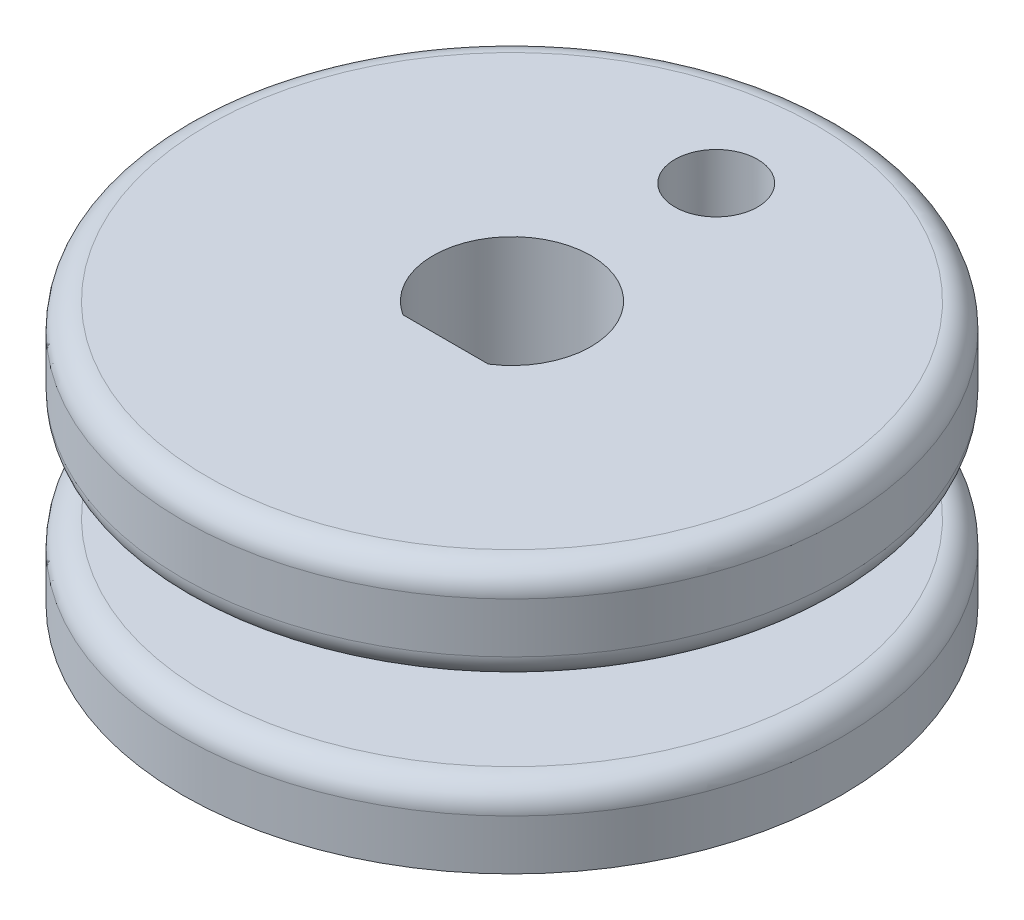
ISO-10303-21;
HEADER;
FILE_DESCRIPTION(('STEP AP214'),'2;1');
FILE_NAME('part.step','',(''),(''),'','','');
FILE_SCHEMA(('AUTOMOTIVE_DESIGN { 1 0 10303 214 1 1 1 1 }'));
ENDSEC;
DATA;
#1=APPLICATION_CONTEXT('core data for automotive mechanical design processes');
#2=APPLICATION_PROTOCOL_DEFINITION('international standard','automotive_design',2000,#1);
#3=PRODUCT_CONTEXT('',#1,'mechanical');
#4=PRODUCT('Part','Part','',(#3));
#5=PRODUCT_RELATED_PRODUCT_CATEGORY('part','',(#4));
#6=PRODUCT_DEFINITION_FORMATION('','',#4);
#7=PRODUCT_DEFINITION_CONTEXT('part definition',#1,'design');
#8=PRODUCT_DEFINITION('design','',#6,#7);
#9=PRODUCT_DEFINITION_SHAPE('','',#8);
#10=(LENGTH_UNIT() NAMED_UNIT(*) SI_UNIT(.MILLI.,.METRE.));
#11=(NAMED_UNIT(*) PLANE_ANGLE_UNIT() SI_UNIT($,.RADIAN.));
#12=(NAMED_UNIT(*) SI_UNIT($,.STERADIAN.) SOLID_ANGLE_UNIT());
#13=UNCERTAINTY_MEASURE_WITH_UNIT(LENGTH_MEASURE(1.E-05),#10,'distance_accuracy_value','');
#14=(GEOMETRIC_REPRESENTATION_CONTEXT(3) GLOBAL_UNCERTAINTY_ASSIGNED_CONTEXT((#13)) GLOBAL_UNIT_ASSIGNED_CONTEXT((#10,
#11,#12)) REPRESENTATION_CONTEXT('',''));
#15=CARTESIAN_POINT('',(0.,0.,0.));
#16=DIRECTION('',(0.,0.,1.));
#17=DIRECTION('',(1.,0.,0.));
#18=AXIS2_PLACEMENT_3D('',#15,#16,#17);
#19=CARTESIAN_POINT('',(13.15,0.,0.));
#20=DIRECTION('',(0.,1.,0.));
#21=DIRECTION('',(0.,0.,1.));
#22=AXIS2_PLACEMENT_3D('',#19,#20,#21);
#23=PLANE('',#22);
#24=CARTESIAN_POINT('',(0.,0.,0.));
#25=DIRECTION('',(0.,1.,0.));
#26=DIRECTION('',(0.,0.,1.));
#27=AXIS2_PLACEMENT_3D('',#24,#25,#26);
#28=CIRCLE('',#27,13.15);
#29=CARTESIAN_POINT('',(0.,0.,13.15));
#30=VERTEX_POINT('',#29);
#31=EDGE_CURVE('E210',#30,#30,#28,.T.);
#32=ORIENTED_EDGE('',*,*,#31,.F.);
#33=EDGE_LOOP('',(#32));
#34=FACE_BOUND('',#33,.T.);
#35=CARTESIAN_POINT('',(0.,0.,0.));
#36=DIRECTION('',(0.,1.,0.));
#37=DIRECTION('',(0.,0.,1.));
#38=AXIS2_PLACEMENT_3D('',#35,#36,#37);
#39=CIRCLE('',#38,6.);
#40=CARTESIAN_POINT('',(0.,0.,6.));
#41=VERTEX_POINT('',#40);
#42=EDGE_CURVE('E11',#41,#41,#39,.F.);
#43=ORIENTED_EDGE('',*,*,#42,.F.);
#44=EDGE_LOOP('',(#43));
#45=FACE_BOUND('',#44,.T.);
#46=ADVANCED_FACE('F41',(#34,#45),#23,.F.);
#47=CARTESIAN_POINT('',(0.,0.,0.));
#48=DIRECTION('',(0.,1.,0.));
#49=DIRECTION('',(0.,0.,1.));
#50=AXIS2_PLACEMENT_3D('',#47,#48,#49);
#51=CYLINDRICAL_SURFACE('',#50,3.15);
#52=CARTESIAN_POINT('',(0.,10.5,0.));
#53=DIRECTION('',(0.,1.,0.));
#54=DIRECTION('',(0.,0.,1.));
#55=AXIS2_PLACEMENT_3D('',#52,#53,#54);
#56=CIRCLE('',#55,3.15);
#57=CARTESIAN_POINT('',(-1.70293863659264,10.5,2.65));
#58=VERTEX_POINT('',#57);
#59=CARTESIAN_POINT('',(1.70293863659264,10.5,2.65));
#60=VERTEX_POINT('',#59);
#61=EDGE_CURVE('E49',#58,#60,#56,.F.);
#62=ORIENTED_EDGE('',*,*,#61,.F.);
#63=DIRECTION('',(0.,-1.,0.));
#64=VECTOR('',#63,1.);
#65=CARTESIAN_POINT('',(-1.70293863659264,20.4423828956117,2.65));
#66=LINE('',#65,#64);
#67=CARTESIAN_POINT('',(-1.70293863659264,-2.,2.65));
#68=VERTEX_POINT('',#67);
#69=EDGE_CURVE('E90',#58,#68,#66,.T.);
#70=ORIENTED_EDGE('',*,*,#69,.T.);
#71=CARTESIAN_POINT('',(0.,-2.,0.));
#72=DIRECTION('',(0.,-1.,0.));
#73=DIRECTION('',(0.,0.,-1.));
#74=AXIS2_PLACEMENT_3D('',#71,#72,#73);
#75=CIRCLE('',#74,3.15);
#76=CARTESIAN_POINT('',(1.70293863659264,-2.,2.65));
#77=VERTEX_POINT('',#76);
#78=EDGE_CURVE('E93',#68,#77,#75,.T.);
#79=ORIENTED_EDGE('',*,*,#78,.T.);
#80=DIRECTION('',(0.,-1.,0.));
#81=VECTOR('',#80,1.);
#82=CARTESIAN_POINT('',(1.70293863659264,20.4423828956117,2.65));
#83=LINE('',#82,#81);
#84=EDGE_CURVE('E81',#60,#77,#83,.T.);
#85=ORIENTED_EDGE('',*,*,#84,.F.);
#86=EDGE_LOOP('',(#62,#70,#79,#85));
#87=FACE_BOUND('',#86,.T.);
#88=ADVANCED_FACE('F88',(#87),#51,.F.);
#89=CARTESIAN_POINT('',(1.70293863659264,20.4423828956117,2.65));
#90=DIRECTION('',(0.,0.,-1.));
#91=DIRECTION('',(-1.,0.,0.));
#92=AXIS2_PLACEMENT_3D('',#89,#90,#91);
#93=PLANE('',#92);
#94=ORIENTED_EDGE('',*,*,#69,.F.);
#95=DIRECTION('',(1.,0.,0.));
#96=VECTOR('',#95,1.);
#97=CARTESIAN_POINT('',(1.70293863659264,10.5,2.65));
#98=LINE('',#97,#96);
#99=EDGE_CURVE('E57',#58,#60,#98,.T.);
#100=ORIENTED_EDGE('',*,*,#99,.T.);
#101=ORIENTED_EDGE('',*,*,#84,.T.);
#102=DIRECTION('',(-1.,0.,0.));
#103=VECTOR('',#102,1.);
#104=CARTESIAN_POINT('',(-1.70293863659264,-2.,2.65));
#105=LINE('',#104,#103);
#106=EDGE_CURVE('E92',#77,#68,#105,.T.);
#107=ORIENTED_EDGE('',*,*,#106,.T.);
#108=EDGE_LOOP('',(#94,#100,#101,#107));
#109=FACE_BOUND('',#108,.T.);
#110=ADVANCED_FACE('F98',(#109),#93,.T.);
#111=CARTESIAN_POINT('',(0.,0.,0.));
#112=DIRECTION('',(0.,1.,0.));
#113=DIRECTION('',(0.,0.,1.));
#114=AXIS2_PLACEMENT_3D('',#111,#112,#113);
#115=CYLINDRICAL_SURFACE('',#114,13.15);
#116=CARTESIAN_POINT('',(0.,2.,0.));
#117=DIRECTION('',(0.,-1.,0.));
#118=DIRECTION('',(0.,0.,-1.));
#119=AXIS2_PLACEMENT_3D('',#116,#117,#118);
#120=CIRCLE('',#119,13.15);
#121=CARTESIAN_POINT('',(0.,2.,-13.15));
#122=VERTEX_POINT('',#121);
#123=EDGE_CURVE('E217',#122,#122,#120,.T.);
#124=ORIENTED_EDGE('',*,*,#123,.T.);
#125=EDGE_LOOP('',(#124));
#126=FACE_BOUND('',#125,.T.);
#127=ORIENTED_EDGE('',*,*,#31,.T.);
#128=EDGE_LOOP('',(#127));
#129=FACE_BOUND('',#128,.T.);
#130=ADVANCED_FACE('F160',(#126,#129),#115,.T.);
#131=CARTESIAN_POINT('',(6.15,3.,0.));
#132=DIRECTION('',(0.,-1.,0.));
#133=DIRECTION('',(0.,0.,-1.));
#134=AXIS2_PLACEMENT_3D('',#131,#132,#133);
#135=PLANE('',#134);
#136=CARTESIAN_POINT('',(0.,3.,0.));
#137=DIRECTION('',(0.,-1.,0.));
#138=DIRECTION('',(0.,0.,-1.));
#139=AXIS2_PLACEMENT_3D('',#136,#137,#138);
#140=CIRCLE('',#139,7.15);
#141=CARTESIAN_POINT('',(0.,3.,-7.15));
#142=VERTEX_POINT('',#141);
#143=EDGE_CURVE('E198',#142,#142,#140,.T.);
#144=ORIENTED_EDGE('',*,*,#143,.T.);
#145=EDGE_LOOP('',(#144));
#146=FACE_BOUND('',#145,.T.);
#147=CARTESIAN_POINT('',(0.,3.,0.));
#148=DIRECTION('',(0.,-1.,0.));
#149=DIRECTION('',(0.,0.,-1.));
#150=AXIS2_PLACEMENT_3D('',#147,#148,#149);
#151=CIRCLE('',#150,12.15);
#152=CARTESIAN_POINT('',(0.,3.,-12.15));
#153=VERTEX_POINT('',#152);
#154=EDGE_CURVE('E205',#153,#153,#151,.F.);
#155=ORIENTED_EDGE('',*,*,#154,.T.);
#156=EDGE_LOOP('',(#155));
#157=FACE_BOUND('',#156,.T.);
#158=ADVANCED_FACE('F157',(#146,#157),#135,.F.);
#159=CARTESIAN_POINT('',(0.,0.,0.));
#160=DIRECTION('',(0.,1.,0.));
#161=DIRECTION('',(0.,0.,1.));
#162=AXIS2_PLACEMENT_3D('',#159,#160,#161);
#163=CYLINDRICAL_SURFACE('',#162,6.15);
#164=CARTESIAN_POINT('',(0.,4.,0.));
#165=DIRECTION('',(0.,-1.,0.));
#166=DIRECTION('',(0.,0.,-1.));
#167=AXIS2_PLACEMENT_3D('',#164,#165,#166);
#168=CIRCLE('',#167,6.15);
#169=CARTESIAN_POINT('',(0.,4.,-6.15));
#170=VERTEX_POINT('',#169);
#171=EDGE_CURVE('E183',#170,#170,#168,.F.);
#172=ORIENTED_EDGE('',*,*,#171,.T.);
#173=EDGE_LOOP('',(#172));
#174=FACE_BOUND('',#173,.T.);
#175=CARTESIAN_POINT('',(1.3127843484041,6.5,-7.15045147462206));
#176=CARTESIAN_POINT('',(1.04201943039474,6.62580417613551,-6.06761894385592));
#177=CARTESIAN_POINT('',(1.31709547902875,5.5384392511523,-6.00730883999833));
#178=CARTESIAN_POINT('',(1.29999795773943,6.5,-7.13378030248643));
#179=CARTESIAN_POINT('',(1.05352528249642,6.60720938370653,-6.06269279068864));
#180=CARTESIAN_POINT('',(1.26815420173258,5.52328600104773,-6.01805865413124));
#181=CARTESIAN_POINT('',(1.28535391653933,6.5,-7.11509785990725));
#182=CARTESIAN_POINT('',(1.06063421512086,6.58438398406775,-6.05974291762612));
#183=CARTESIAN_POINT('',(1.2181836288793,5.51291016419798,-6.02836916312205));
#184=CARTESIAN_POINT('',(1.25129735969783,6.5,-7.07412083590968));
#185=CARTESIAN_POINT('',(1.06264570010002,6.53484200602748,-6.05757336936055));
#186=CARTESIAN_POINT('',(1.11832476871229,5.50081077814163,-6.04767043834936));
#187=CARTESIAN_POINT('',(1.23199392769864,6.5,-7.05191238150087));
#188=CARTESIAN_POINT('',(1.05807280539704,6.50845185206623,-6.0581983266329));
#189=CARTESIAN_POINT('',(1.0684577316884,5.49890631686951,-6.05668477927272));
#190=CARTESIAN_POINT('',(1.19016344800248,6.5,-7.00684277997503));
#191=CARTESIAN_POINT('',(1.03683458778687,6.45855806361104,-6.06219366481164));
#192=CARTESIAN_POINT('',(0.975488457942046,5.50205963254275,-6.07230217026224));
#193=CARTESIAN_POINT('',(1.16842378399548,6.5,-6.98447480328383));
#194=CARTESIAN_POINT('',(1.02220347215222,6.43531445915879,-6.06511341829274));
#195=CARTESIAN_POINT('',(0.932382110146065,5.50621191766008,-6.07906645716621));
#196=CARTESIAN_POINT('',(1.11912346520524,6.5,-6.93705350439338));
#197=CARTESIAN_POINT('',(0.98277076333591,6.39063772801981,-6.07250505017338));
#198=CARTESIAN_POINT('',(0.846506896377061,5.51899256956758,-6.09161774292795));
#199=CARTESIAN_POINT('',(1.09155889521425,6.5,-6.91199838163673));
#200=CARTESIAN_POINT('',(0.958259250261157,6.36921118246873,-6.07693111209655));
#201=CARTESIAN_POINT('',(0.803738277567529,5.52762395269032,-6.0974040797251));
#202=CARTESIAN_POINT('',(1.02877554087987,6.5,-6.85932955119865));
#203=CARTESIAN_POINT('',(0.899148274282506,6.32949393555928,-6.08669110781247));
#204=CARTESIAN_POINT('',(0.717980252858712,5.54850824237402,-6.10810178400074));
#205=CARTESIAN_POINT('',(0.99343122157243,6.5,-6.83167873440837));
#206=CARTESIAN_POINT('',(0.864661540570795,6.31118916209162,-6.09201329363481));
#207=CARTESIAN_POINT('',(0.675000086390885,5.56082189605999,-6.11299606296244));
#208=CARTESIAN_POINT('',(0.913828808476283,6.5,-6.77530080949762));
#209=CARTESIAN_POINT('',(0.786729869202295,6.27913669131568,-6.10279361029693));
#210=CARTESIAN_POINT('',(0.589497709066172,5.58772018676518,-6.12183312770505));
#211=CARTESIAN_POINT('',(0.869572265583208,6.5,-6.74657388934651));
#212=CARTESIAN_POINT('',(0.743519372589439,6.26527232221814,-6.10824783675761));
#213=CARTESIAN_POINT('',(0.546975419884405,5.60230442855904,-6.12577607877297));
#214=CARTESIAN_POINT('',(0.773791980389226,6.5,-6.69171881956269));
#215=CARTESIAN_POINT('',(0.652161908003435,6.2429907440322,-6.11834962774675));
#216=CARTESIAN_POINT('',(0.464850057399202,5.63118983103073,-6.13253608134874));
#217=CARTESIAN_POINT('',(0.722940346879625,6.5,-6.66554425753131));
#218=CARTESIAN_POINT('',(0.604700506220856,6.23418109011878,-6.12303519120669));
#219=CARTESIAN_POINT('',(0.425239479694907,5.64544618466377,-6.1354102525107));
#220=CARTESIAN_POINT('',(0.610936935296231,6.5,-6.61605030436122));
#221=CARTESIAN_POINT('',(0.50350264960542,6.22022124889756,-6.13157885886108));
#222=CARTESIAN_POINT('',(0.345663521389621,5.67294509306369,-6.14040778803974));
#223=CARTESIAN_POINT('',(0.549776854377754,6.5,-6.59273324112492));
#224=CARTESIAN_POINT('',(0.449735812891642,6.21498096637913,-6.13546529374919));
#225=CARTESIAN_POINT('',(0.30569787958331,5.68618681800097,-6.14253054287838));
#226=CARTESIAN_POINT('',(0.418795378426861,6.5,-6.55260798451918));
#227=CARTESIAN_POINT('',(0.338214897762957,6.20740453632916,-6.14193702490164));
#228=CARTESIAN_POINT('',(0.226008039384106,5.70923625577028,-6.14597180329572));
#229=CARTESIAN_POINT('',(0.349224390472018,6.5,-6.53565363326016));
#230=CARTESIAN_POINT('',(0.280427685906946,6.20494276307205,-6.14458379473749));
#231=CARTESIAN_POINT('',(0.186302135462554,5.71912050990874,-6.1473088284107));
#232=CARTESIAN_POINT('',(0.202884671617475,6.5,-6.51085963783064));
#233=CARTESIAN_POINT('',(0.161594548139622,6.20172875753899,-6.14837644757747));
#234=CARTESIAN_POINT('',(0.106215643730336,5.73364374686564,-6.1492123622092));
#235=CARTESIAN_POINT('',(0.126136214194429,6.5,-6.50299511171356));
#236=CARTESIAN_POINT('',(0.100188110206605,6.2009455183902,-6.14955281336864));
#237=CARTESIAN_POINT('',(0.0658372061053902,5.7382970476223,-6.14978097502525));
#238=CARTESIAN_POINT('',(-0.0306001423340267,6.5,-6.49838778387458));
#239=CARTESIAN_POINT('',(-0.0242638770388407,6.200461642862,-6.15024043781845));
#240=CARTESIAN_POINT('',(-0.0160110200897598,5.74101749000896,-6.15011813244039));
#241=CARTESIAN_POINT('',(-0.110622097708201,6.5,-6.50189793433717));
#242=CARTESIAN_POINT('',(-0.0878460754356238,6.20078171284095,-6.1497196203914));
#243=CARTESIAN_POINT('',(-0.0574850021710199,5.73893483821878,-6.14986847887742));
#244=CARTESIAN_POINT('',(-0.265176079438557,6.5,-6.5195694584828));
#245=CARTESIAN_POINT('',(-0.211802048852702,6.20282639280922,-6.14705317811521));
#246=CARTESIAN_POINT('',(-0.139881690342273,5.72853667877155,-6.14854794084975));
#247=CARTESIAN_POINT('',(-0.339693706481335,6.5,-6.53375775292792));
#248=CARTESIAN_POINT('',(-0.272637782164196,6.20457191642582,-6.14488216661165));
#249=CARTESIAN_POINT('',(-0.180802736545599,5.72020541787397,-6.14747498060543));
#250=CARTESIAN_POINT('',(-0.48082212570908,6.5,-6.56987566848276));
#251=CARTESIAN_POINT('',(-0.390458057955785,6.21045971678479,-6.13918396472128));
#252=CARTESIAN_POINT('',(-0.262852025443541,5.69927865768724,-6.14452126767886));
#253=CARTESIAN_POINT('',(-0.547177578336058,6.5,-6.5919966088058));
#254=CARTESIAN_POINT('',(-0.447567423935475,6.21471429442679,-6.13558755378283));
#255=CARTESIAN_POINT('',(-0.30395809232261,5.68657811924205,-6.14262027679654));
#256=CARTESIAN_POINT('',(-0.668920636543549,6.5,-6.64025093609818));
#257=CARTESIAN_POINT('',(-0.555335412963292,6.22662252632504,-6.12745265326971));
#258=CARTESIAN_POINT('',(-0.385653302875333,5.65941384309671,-6.13803264248346));
#259=CARTESIAN_POINT('',(-0.724311464497264,6.5,-6.66638314018428));
#260=CARTESIAN_POINT('',(-0.606078454456055,6.234365039,-6.12288015189725));
#261=CARTESIAN_POINT('',(-0.426242595131948,5.64495062545199,-6.13534623045525));
#262=CARTESIAN_POINT('',(-0.831829849784346,6.5,-6.72355064401057));
#263=CARTESIAN_POINT('',(-0.707170737141799,6.25518113511129,-6.11253760587392));
#264=CARTESIAN_POINT('',(-0.512857404625769,5.61424072892563,-6.12875264232603));
#265=CARTESIAN_POINT('',(-0.882518143583902,6.5,-6.75477286856177));
#266=CARTESIAN_POINT('',(-0.75627911636861,6.26894990150504,-6.10667707568332));
#267=CARTESIAN_POINT('',(-0.558880330639355,5.59801562286827,-6.12472991743925));
#268=CARTESIAN_POINT('',(-0.973001001220349,6.5,-6.81629900786756));
#269=CARTESIAN_POINT('',(-0.844720765926835,6.30166694202995,-6.0949591628455));
#270=CARTESIAN_POINT('',(-0.651398974267791,5.56788772038703,-6.11558151668609));
#271=CARTESIAN_POINT('',(-1.01279606677985,6.5,-6.84660296485873));
#272=CARTESIAN_POINT('',(-0.883782375272829,6.32077071398918,-6.08910017055528));
#273=CARTESIAN_POINT('',(-0.697894670005378,5.55398481701814,-6.11045589163673));
#274=CARTESIAN_POINT('',(-1.08279427461592,6.5,-6.90418105120004));
#275=CARTESIAN_POINT('',(-0.950367542951224,6.36278103231907,-6.07832504826278));
#276=CARTESIAN_POINT('',(-0.790575331344258,5.53043092781574,-6.09914926698597));
#277=CARTESIAN_POINT('',(-1.11317670560051,6.5,-6.9315044170236));
#278=CARTESIAN_POINT('',(-0.977775555037024,6.38570485736853,-6.07342009546246));
#279=CARTESIAN_POINT('',(-0.836747251409277,5.52069890796217,-6.09299195781663));
#280=CARTESIAN_POINT('',(-1.16706959567998,6.5,-6.98302355189579));
#281=CARTESIAN_POINT('',(-1.02142341844502,6.43377867753672,-6.06527864837846));
#282=CARTESIAN_POINT('',(-0.929500929771427,5.50641907721102,-6.07953314433546));
#283=CARTESIAN_POINT('',(-1.19058525363657,6.5,-7.00722167929306));
#284=CARTESIAN_POINT('',(-1.03729648389252,6.45892447058359,-6.06209915683361));
#285=CARTESIAN_POINT('',(-0.976082350364762,5.50186733669799,-6.07223251210574));
#286=CARTESIAN_POINT('',(-1.23544815371582,6.5,-7.05572983890282));
#287=CARTESIAN_POINT('',(-1.05955258915725,6.51285309552465,-6.05792887066099));
#288=CARTESIAN_POINT('',(-1.07656639420163,5.49884631038408,-6.05528513251608));
#289=CARTESIAN_POINT('',(-1.2558795137834,6.5,-7.07946426841774));
#290=CARTESIAN_POINT('',(-1.06353473441127,6.54131281846987,-6.05747263528619));
#291=CARTESIAN_POINT('',(-1.13047346480269,5.50144086296735,-6.04545002340193));
#292=CARTESIAN_POINT('',(-1.28261206870359,6.5,-7.11192216951693));
#293=CARTESIAN_POINT('',(-1.05986086793616,6.58033725306628,-6.05988214133986));
#294=CARTESIAN_POINT('',(-1.21114574827532,5.51272219641762,-6.0296277834272));
#295=CARTESIAN_POINT('',(-1.29095874010418,6.5,-7.12234064908402));
#296=CARTESIAN_POINT('',(-1.05683942294825,6.59294687157487,-6.06127021351924));
#297=CARTESIAN_POINT('',(-1.23838701676536,5.51784139235198,-6.02408953376717));
#298=CARTESIAN_POINT('',(-1.30638322924301,6.5,-7.14202316291026));
#299=CARTESIAN_POINT('',(-1.04788919697319,6.61629574060353,-6.06514375729258));
#300=CARTESIAN_POINT('',(-1.29236828797796,5.53076027537579,-6.01274051382008));
#301=CARTESIAN_POINT('',(-1.31345963437879,6.5,-7.15128590848641));
#302=CARTESIAN_POINT('',(-1.04193111768931,6.62699131409978,-6.06763986536793));
#303=CARTESIAN_POINT('',(-1.31910770339664,5.53856291883673,-6.00692944909381));
#304=CARTESIAN_POINT('',(-1.31999476261129,6.5,-7.15999301685355));
#305=CARTESIAN_POINT('',(-1.03486971890119,6.63643976878541,-6.07065711289051));
#306=CARTESIAN_POINT('',(-1.34548670733654,5.54775629994193,-6.00101370773144));
#307=(BOUNDED_SURFACE() B_SPLINE_SURFACE(3,2,((#175,#176,#177),(#178,#179,#180),(#181,#182,
#183),(#184,#185,#186),(#187,#188,#189),(#190,#191,#192),(#193,#194,#195),(#196,#197,#198),
(#199,#200,#201),(#202,#203,#204),(#205,#206,#207),(#208,#209,#210),(#211,#212,#213),(#214,#215,
#216),(#217,#218,#219),(#220,#221,#222),(#223,#224,#225),(#226,#227,#228),(#229,#230,#231),
(#232,#233,#234),(#235,#236,#237),(#238,#239,#240),(#241,#242,#243),(#244,#245,#246),(#247,#248,
#249),(#250,#251,#252),(#253,#254,#255),(#256,#257,#258),(#259,#260,#261),(#262,#263,#264),
(#265,#266,#267),(#268,#269,#270),(#271,#272,#273),(#274,#275,#276),(#277,#278,#279),(#280,#281,
#282),(#283,#284,#285),(#286,#287,#288),(#289,#290,#291),(#292,#293,#294),(#295,#296,#297),
(#298,#299,#300),(#301,#302,#303),(#304,#305,#306)),.UNSPECIFIED.,.F.,.F.,
.F.) B_SPLINE_SURFACE_WITH_KNOTS((4,2,2,2,2,2,2,2,2,2,2,2,2,2,2,2,2,2,2,2,2,4),(3,3),(0.,
0.180130853139198,0.356395826590208,0.508856869320484,0.661420716486397,0.816655066437159,
0.97186242597979,1.11682974517512,1.26191438988089,1.40342588626654,1.54454909316475,
1.6888319772445,1.83347983779957,1.98188102577493,2.13023853543746,2.29853640177479,
2.46682651530866,2.63167982283553,2.79640799371385,2.98692603795705,3.08498639074124,
3.18315512517628),(0.,1.),
.UNSPECIFIED.) GEOMETRIC_REPRESENTATION_ITEM() RATIONAL_B_SPLINE_SURFACE(((1.,0.664944970906181,
1.),(1.,0.671314099560411,1.),(1.,0.678696111782046,1.),(1.,0.695086416828009,1.),(1.,
0.704056407091086,1.),(1.,0.722202141427913,1.),(1.,0.731186509011496,1.),(1.,0.750028734042048,
1.),(1.,0.759887176397958,1.),(1.,0.780290846215451,1.),(1.,0.790845074691656,1.),(1.,
0.811977724297497,1.),(1.,0.822556140901727,1.),(1.,0.842396546322217,1.),(1.,0.85169934166109,
1.),(1.,0.869032017974004,1.),(1.,0.8770608626547,1.),(1.,0.890727935218334,1.),(1.,
0.896420169460037,1.),(1.,0.904703495900638,1.),(1.,0.907303054381662,1.),(1.,0.908829336428992,
1.),(1.,0.90767252394913,1.),(1.,0.901796733315439,1.),(1.,0.897068751746797,1.),(1.,
0.884867797759554,1.),(1.,0.877326781580424,1.),(1.,0.860598468962673,1.),(1.,0.851411657720229,
1.),(1.,0.830950485851425,1.),(1.,0.81956150611744,1.),(1.,0.796671123143873,1.),(1.,
0.785169725107357,1.),(1.,0.762950937960331,1.),(1.,0.752222334597996,1.),(1.,0.731772990278286,
1.),(1.,0.722051490455768,1.),(1.,0.702516872994636,1.),(1.,0.692927696233917,1.),(1.,
0.679984045823971,1.),(1.,0.67586226463417,1.),(1.,0.668171225574034,1.),(1.,0.664602583417727,
1.),(1.,0.661314799751352,1.))) REPRESENTATION_ITEM('') SURFACE());
#308=CARTESIAN_POINT('',(-1.34548670733654,5.54775629994193,-6.00101370773144));
#309=CARTESIAN_POINT('',(-1.31910770339664,5.53856291883673,-6.00692944909381));
#310=CARTESIAN_POINT('',(-1.29236828797796,5.53076027537579,-6.01274051382008));
#311=CARTESIAN_POINT('',(-1.23838701676536,5.51784139235198,-6.02408953376717));
#312=CARTESIAN_POINT('',(-1.21114574827532,5.51272219641762,-6.0296277834272));
#313=CARTESIAN_POINT('',(-1.13047346480269,5.50144086296735,-6.04545002340194));
#314=CARTESIAN_POINT('',(-1.07656639420163,5.49884631038408,-6.05528513251608));
#315=CARTESIAN_POINT('',(-0.976082350364762,5.50186733669799,-6.07223251210574));
#316=CARTESIAN_POINT('',(-0.929500929771427,5.50641907721102,-6.07953314433546));
#317=CARTESIAN_POINT('',(-0.836747251409277,5.52069890796217,-6.09299195781663));
#318=CARTESIAN_POINT('',(-0.790575331344258,5.53043092781574,-6.09914926698597));
#319=CARTESIAN_POINT('',(-0.697894670005378,5.55398481701814,-6.11045589163673));
#320=CARTESIAN_POINT('',(-0.651398974267791,5.56788772038703,-6.11558151668609));
#321=CARTESIAN_POINT('',(-0.558880330639355,5.59801562286827,-6.12472991743925));
#322=CARTESIAN_POINT('',(-0.512857404625769,5.61424072892563,-6.12875264232602));
#323=CARTESIAN_POINT('',(-0.426242595131948,5.64495062545199,-6.13534623045525));
#324=CARTESIAN_POINT('',(-0.385653302875333,5.65941384309671,-6.13803264248346));
#325=CARTESIAN_POINT('',(-0.30395809232261,5.68657811924205,-6.14262027679654));
#326=CARTESIAN_POINT('',(-0.262852025443541,5.69927865768724,-6.14452126767886));
#327=CARTESIAN_POINT('',(-0.180802736545599,5.72020541787397,-6.14747498060543));
#328=CARTESIAN_POINT('',(-0.139881690342273,5.72853667877155,-6.14854794084975));
#329=CARTESIAN_POINT('',(-0.0574850021710199,5.73893483821878,-6.14986847887742));
#330=CARTESIAN_POINT('',(-0.0160110200897598,5.74101749000896,-6.15011813244039));
#331=CARTESIAN_POINT('',(0.0658372061053903,5.7382970476223,-6.14978097502525));
#332=CARTESIAN_POINT('',(0.106215643730336,5.73364374686564,-6.1492123622092));
#333=CARTESIAN_POINT('',(0.186302135462554,5.71912050990874,-6.1473088284107));
#334=CARTESIAN_POINT('',(0.226008039384106,5.70923625577028,-6.14597180329572));
#335=CARTESIAN_POINT('',(0.30569787958331,5.68618681800098,-6.14253054287838));
#336=CARTESIAN_POINT('',(0.345663521389621,5.67294509306369,-6.14040778803974));
#337=CARTESIAN_POINT('',(0.425239479694907,5.64544618466377,-6.1354102525107));
#338=CARTESIAN_POINT('',(0.464850057399202,5.63118983103073,-6.13253608134874));
#339=CARTESIAN_POINT('',(0.546975419884405,5.60230442855904,-6.12577607877297));
#340=CARTESIAN_POINT('',(0.589497709066172,5.58772018676518,-6.12183312770505));
#341=CARTESIAN_POINT('',(0.675000086390885,5.56082189605999,-6.11299606296244));
#342=CARTESIAN_POINT('',(0.717980252858712,5.54850824237402,-6.10810178400074));
#343=CARTESIAN_POINT('',(0.803738277567529,5.52762395269032,-6.0974040797251));
#344=CARTESIAN_POINT('',(0.846506896377061,5.51899256956758,-6.09161774292795));
#345=CARTESIAN_POINT('',(0.932382110146065,5.50621191766008,-6.07906645716621));
#346=CARTESIAN_POINT('',(0.975488457942046,5.50205963254275,-6.07230217026224));
#347=CARTESIAN_POINT('',(1.0684577316884,5.49890631686951,-6.05668477927272));
#348=CARTESIAN_POINT('',(1.11832476871229,5.50081077814163,-6.04767043834936));
#349=CARTESIAN_POINT('',(1.2181836288793,5.51291016419798,-6.02836916312205));
#350=CARTESIAN_POINT('',(1.26815420173258,5.52328600104773,-6.01805865413124));
#351=CARTESIAN_POINT('',(1.31709547902875,5.5384392511523,-6.00730883999833));
#352=B_SPLINE_CURVE_WITH_KNOTS('',3,(#308,#309,#310,#311,#312,#313,#314,#315,#316,#317,#318,
#319,#320,#321,#322,#323,#324,#325,#326,#327,#328,#329,#330,#331,#332,#333,#334,#335,#336,#337,
#338,#339,#340,#341,#342,#343,#344,#345,#346,#347,#348,#349,#350,#351),.UNSPECIFIED.,.F.,.F.,(4,
2,2,2,2,2,2,2,2,2,2,2,2,2,2,2,2,2,2,2,2,4),(0.,0.098168734435041,0.19622908721923,
0.386747131462434,0.55147530234075,0.716328609867619,0.884618723401488,1.05291658973882,
1.20127409940135,1.34967528737672,1.49432314793178,1.63860603201154,1.77972923890974,
1.92124073529539,2.06632538000116,2.21129269919649,2.36650005873912,2.52173440868989,
2.6742982558558,2.82675929858607,3.00302427203708,3.18315512517628),.UNSPECIFIED.);
#353=CARTESIAN_POINT('',(-1.05344595970079,5.5,-6.05910485220301));
#354=VERTEX_POINT('',#353);
#355=CARTESIAN_POINT('',(1.05344595970079,5.5,-6.05910485220301));
#356=VERTEX_POINT('',#355);
#357=EDGE_CURVE('E180',#354,#356,#352,.T.);
#358=ORIENTED_EDGE('',*,*,#357,.T.);
#359=CARTESIAN_POINT('',(0.,5.5,0.));
#360=DIRECTION('',(0.,1.,0.));
#361=DIRECTION('',(0.,0.,1.));
#362=AXIS2_PLACEMENT_3D('',#359,#360,#361);
#363=CIRCLE('',#362,6.15);
#364=EDGE_CURVE('E77',#356,#354,#363,.F.);
#365=ORIENTED_EDGE('',*,*,#364,.T.);
#366=EDGE_LOOP('',(#358,#365));
#367=FACE_BOUND('',#366,.T.);
#368=ADVANCED_FACE('F165',(#174,#367),#163,.T.);
#369=CARTESIAN_POINT('',(13.15,6.5,0.));
#370=DIRECTION('',(0.,1.,0.));
#371=DIRECTION('',(0.,0.,1.));
#372=AXIS2_PLACEMENT_3D('',#369,#370,#371);
#373=PLANE('',#372);
#374=CARTESIAN_POINT('',(0.,6.5,0.));
#375=DIRECTION('',(0.,1.,0.));
#376=DIRECTION('',(0.,0.,1.));
#377=AXIS2_PLACEMENT_3D('',#374,#375,#376);
#378=CIRCLE('',#377,12.15);
#379=CARTESIAN_POINT('',(0.,6.5,12.15));
#380=VERTEX_POINT('',#379);
#381=EDGE_CURVE('E206',#380,#380,#378,.F.);
#382=ORIENTED_EDGE('',*,*,#381,.T.);
#383=EDGE_LOOP('',(#382));
#384=FACE_BOUND('',#383,.T.);
#385=CARTESIAN_POINT('',(0.,6.5,-8.15));
#386=DIRECTION('',(0.,1.,0.));
#387=DIRECTION('',(0.,0.,1.));
#388=AXIS2_PLACEMENT_3D('',#385,#386,#387);
#389=CIRCLE('',#388,1.65);
#390=CARTESIAN_POINT('',(1.2247379856684,6.5,-7.04432515337423));
#391=VERTEX_POINT('',#390);
#392=CARTESIAN_POINT('',(-1.2247379856684,6.5,-7.04432515337423));
#393=VERTEX_POINT('',#392);
#394=EDGE_CURVE('E213',#391,#393,#389,.T.);
#395=ORIENTED_EDGE('',*,*,#394,.T.);
#396=CARTESIAN_POINT('',(0.,6.5,0.));
#397=DIRECTION('',(0.,1.,0.));
#398=DIRECTION('',(0.,0.,1.));
#399=AXIS2_PLACEMENT_3D('',#396,#397,#398);
#400=CIRCLE('',#399,7.15);
#401=EDGE_CURVE('E215',#393,#391,#400,.T.);
#402=ORIENTED_EDGE('',*,*,#401,.T.);
#403=EDGE_LOOP('',(#395,#402));
#404=FACE_BOUND('',#403,.T.);
#405=ADVANCED_FACE('F169',(#384,#404),#373,.F.);
#406=CARTESIAN_POINT('',(0.,0.,0.));
#407=DIRECTION('',(0.,1.,0.));
#408=DIRECTION('',(0.,0.,1.));
#409=AXIS2_PLACEMENT_3D('',#406,#407,#408);
#410=CYLINDRICAL_SURFACE('',#409,13.15);
#411=CARTESIAN_POINT('',(0.,7.5,0.));
#412=DIRECTION('',(0.,1.,0.));
#413=DIRECTION('',(0.,0.,1.));
#414=AXIS2_PLACEMENT_3D('',#411,#412,#413);
#415=CIRCLE('',#414,13.15);
#416=CARTESIAN_POINT('',(0.,7.5,13.15));
#417=VERTEX_POINT('',#416);
#418=EDGE_CURVE('E214',#417,#417,#415,.T.);
#419=ORIENTED_EDGE('',*,*,#418,.T.);
#420=EDGE_LOOP('',(#419));
#421=FACE_BOUND('',#420,.T.);
#422=CARTESIAN_POINT('',(0.,9.5,0.));
#423=DIRECTION('',(0.,-1.,0.));
#424=DIRECTION('',(0.,0.,-1.));
#425=AXIS2_PLACEMENT_3D('',#422,#423,#424);
#426=CIRCLE('',#425,13.15);
#427=CARTESIAN_POINT('',(0.,9.5,-13.15));
#428=VERTEX_POINT('',#427);
#429=EDGE_CURVE('E212',#428,#428,#426,.T.);
#430=ORIENTED_EDGE('',*,*,#429,.T.);
#431=EDGE_LOOP('',(#430));
#432=FACE_BOUND('',#431,.T.);
#433=ADVANCED_FACE('F246',(#421,#432),#410,.T.);
#434=CARTESIAN_POINT('',(6.15,10.5,0.));
#435=DIRECTION('',(0.,-1.,0.));
#436=DIRECTION('',(0.,0.,-1.));
#437=AXIS2_PLACEMENT_3D('',#434,#435,#436);
#438=PLANE('',#437);
#439=CARTESIAN_POINT('',(0.,10.5,0.));
#440=DIRECTION('',(0.,-1.,0.));
#441=DIRECTION('',(0.,0.,-1.));
#442=AXIS2_PLACEMENT_3D('',#439,#440,#441);
#443=CIRCLE('',#442,12.15);
#444=CARTESIAN_POINT('',(0.,10.5,-12.15));
#445=VERTEX_POINT('',#444);
#446=EDGE_CURVE('E187',#445,#445,#443,.F.);
#447=ORIENTED_EDGE('',*,*,#446,.T.);
#448=EDGE_LOOP('',(#447));
#449=FACE_BOUND('',#448,.T.);
#450=CARTESIAN_POINT('',(0.,10.5,-8.15));
#451=DIRECTION('',(0.,-1.,0.));
#452=DIRECTION('',(0.,0.,-1.));
#453=AXIS2_PLACEMENT_3D('',#450,#451,#452);
#454=CIRCLE('',#453,1.64999999999999);
#455=CARTESIAN_POINT('',(0.,10.5,-9.79999999999999));
#456=VERTEX_POINT('',#455);
#457=EDGE_CURVE('E228',#456,#456,#454,.T.);
#458=ORIENTED_EDGE('',*,*,#457,.T.);
#459=EDGE_LOOP('',(#458));
#460=FACE_BOUND('',#459,.T.);
#461=ORIENTED_EDGE('',*,*,#61,.T.);
#462=ORIENTED_EDGE('',*,*,#99,.F.);
#463=EDGE_LOOP('',(#461,#462));
#464=FACE_BOUND('',#463,.T.);
#465=ADVANCED_FACE('F194',(#449,#460,#464),#438,.F.);
#466=CARTESIAN_POINT('',(0.,17.,-8.15));
#467=DIRECTION('',(0.,1.,0.));
#468=DIRECTION('',(0.,0.,1.));
#469=AXIS2_PLACEMENT_3D('',#466,#467,#468);
#470=CYLINDRICAL_SURFACE('',#469,1.64999999999999);
#471=ORIENTED_EDGE('',*,*,#394,.F.);
#472=EDGE_CURVE('E224',#393,#391,#389,.T.);
#473=ORIENTED_EDGE('',*,*,#472,.F.);
#474=EDGE_LOOP('',(#471,#473));
#475=FACE_BOUND('',#474,.T.);
#476=ORIENTED_EDGE('',*,*,#457,.F.);
#477=EDGE_LOOP('',(#476));
#478=FACE_BOUND('',#477,.T.);
#479=ADVANCED_FACE('F43',(#475,#478),#470,.F.);
#480=CARTESIAN_POINT('',(0.,4.,0.));
#481=DIRECTION('',(0.,-1.,0.));
#482=DIRECTION('',(0.,0.,-1.));
#483=AXIS2_PLACEMENT_3D('',#480,#481,#482);
#484=TOROIDAL_SURFACE('',#483,7.15,1.);
#485=ORIENTED_EDGE('',*,*,#143,.F.);
#486=EDGE_LOOP('',(#485));
#487=FACE_BOUND('',#486,.T.);
#488=ORIENTED_EDGE('',*,*,#171,.F.);
#489=EDGE_LOOP('',(#488));
#490=FACE_BOUND('',#489,.T.);
#491=ADVANCED_FACE('F124',(#487,#490),#484,.F.);
#492=CARTESIAN_POINT('',(0.,5.5,0.));
#493=DIRECTION('',(0.,1.,0.));
#494=DIRECTION('',(0.,0.,1.));
#495=AXIS2_PLACEMENT_3D('',#492,#493,#494);
#496=TOROIDAL_SURFACE('',#495,7.15,1.);
#497=CARTESIAN_POINT('',(-1.2247379856684,5.5,-7.04432515337423));
#498=DIRECTION('',(-0.985220301171222,0.,0.171292025967608));
#499=DIRECTION('',(0.171292025967608,0.,0.985220301171222));
#500=AXIS2_PLACEMENT_3D('',#497,#498,#499);
#501=CIRCLE('',#500,1.);
#502=EDGE_CURVE('E221',#354,#393,#501,.T.);
#503=ORIENTED_EDGE('',*,*,#502,.F.);
#504=ORIENTED_EDGE('',*,*,#364,.F.);
#505=CARTESIAN_POINT('',(1.2247379856684,5.5,-7.04432515337423));
#506=DIRECTION('',(0.985220301171222,0.,0.171292025967608));
#507=DIRECTION('',(0.171292025967608,0.,-0.985220301171222));
#508=AXIS2_PLACEMENT_3D('',#505,#506,#507);
#509=CIRCLE('',#508,1.);
#510=EDGE_CURVE('E222',#391,#356,#509,.T.);
#511=ORIENTED_EDGE('',*,*,#510,.F.);
#512=ORIENTED_EDGE('',*,*,#401,.F.);
#513=EDGE_LOOP('',(#503,#504,#511,#512));
#514=FACE_BOUND('',#513,.T.);
#515=ADVANCED_FACE('F118',(#514),#496,.F.);
#516=ORIENTED_EDGE('',*,*,#510,.T.);
#517=ORIENTED_EDGE('',*,*,#357,.F.);
#518=ORIENTED_EDGE('',*,*,#502,.T.);
#519=ORIENTED_EDGE('',*,*,#472,.T.);
#520=EDGE_LOOP('',(#516,#517,#518,#519));
#521=FACE_BOUND('',#520,.T.);
#522=ADVANCED_FACE('F125',(#521),#307,.F.);
#523=CARTESIAN_POINT('',(0.,7.5,0.));
#524=DIRECTION('',(0.,1.,0.));
#525=DIRECTION('',(0.,0.,1.));
#526=AXIS2_PLACEMENT_3D('',#523,#524,#525);
#527=TOROIDAL_SURFACE('',#526,12.15,1.);
#528=ORIENTED_EDGE('',*,*,#381,.F.);
#529=EDGE_LOOP('',(#528));
#530=FACE_BOUND('',#529,.T.);
#531=ORIENTED_EDGE('',*,*,#418,.F.);
#532=EDGE_LOOP('',(#531));
#533=FACE_BOUND('',#532,.T.);
#534=ADVANCED_FACE('F123',(#530,#533),#527,.T.);
#535=CARTESIAN_POINT('',(0.,9.5,0.));
#536=DIRECTION('',(0.,-1.,0.));
#537=DIRECTION('',(0.,0.,-1.));
#538=AXIS2_PLACEMENT_3D('',#535,#536,#537);
#539=TOROIDAL_SURFACE('',#538,12.15,1.);
#540=ORIENTED_EDGE('',*,*,#429,.F.);
#541=EDGE_LOOP('',(#540));
#542=FACE_BOUND('',#541,.T.);
#543=ORIENTED_EDGE('',*,*,#446,.F.);
#544=EDGE_LOOP('',(#543));
#545=FACE_BOUND('',#544,.T.);
#546=ADVANCED_FACE('F126',(#542,#545),#539,.T.);
#547=CARTESIAN_POINT('',(0.,2.,0.));
#548=DIRECTION('',(0.,-1.,0.));
#549=DIRECTION('',(0.,0.,-1.));
#550=AXIS2_PLACEMENT_3D('',#547,#548,#549);
#551=TOROIDAL_SURFACE('',#550,12.15,1.);
#552=ORIENTED_EDGE('',*,*,#123,.F.);
#553=EDGE_LOOP('',(#552));
#554=FACE_BOUND('',#553,.T.);
#555=ORIENTED_EDGE('',*,*,#154,.F.);
#556=EDGE_LOOP('',(#555));
#557=FACE_BOUND('',#556,.T.);
#558=ADVANCED_FACE('F131',(#554,#557),#551,.T.);
#559=CARTESIAN_POINT('',(0.,-2.,0.));
#560=DIRECTION('',(0.,-1.,0.));
#561=DIRECTION('',(0.,0.,-1.));
#562=AXIS2_PLACEMENT_3D('',#559,#560,#561);
#563=PLANE('',#562);
#564=CARTESIAN_POINT('',(0.,-2.,0.));
#565=DIRECTION('',(0.,-1.,0.));
#566=DIRECTION('',(0.,0.,-1.));
#567=AXIS2_PLACEMENT_3D('',#564,#565,#566);
#568=CIRCLE('',#567,6.);
#569=CARTESIAN_POINT('',(0.,-2.,-6.));
#570=VERTEX_POINT('',#569);
#571=EDGE_CURVE('E91',#570,#570,#568,.T.);
#572=ORIENTED_EDGE('',*,*,#571,.T.);
#573=EDGE_LOOP('',(#572));
#574=FACE_BOUND('',#573,.T.);
#575=ORIENTED_EDGE('',*,*,#106,.F.);
#576=ORIENTED_EDGE('',*,*,#78,.F.);
#577=EDGE_LOOP('',(#575,#576));
#578=FACE_BOUND('',#577,.T.);
#579=ADVANCED_FACE('F100',(#574,#578),#563,.T.);
#580=CARTESIAN_POINT('',(0.,-2.,0.));
#581=DIRECTION('',(0.,1.,0.));
#582=DIRECTION('',(0.,0.,1.));
#583=AXIS2_PLACEMENT_3D('',#580,#581,#582);
#584=CYLINDRICAL_SURFACE('',#583,6.);
#585=ORIENTED_EDGE('',*,*,#571,.F.);
#586=EDGE_LOOP('',(#585));
#587=FACE_BOUND('',#586,.T.);
#588=ORIENTED_EDGE('',*,*,#42,.T.);
#589=EDGE_LOOP('',(#588));
#590=FACE_BOUND('',#589,.T.);
#591=ADVANCED_FACE('F140',(#587,#590),#584,.T.);
#592=CLOSED_SHELL('',(#46,#88,#110,#130,#158,#368,#405,#433,#465,#479,#491,#515,#522,#534,#546,
#558,#579,#591));
#593=MANIFOLD_SOLID_BREP('B2',#592);
#594=ADVANCED_BREP_SHAPE_REPRESENTATION('',(#18,#593),#14);
#595=SHAPE_DEFINITION_REPRESENTATION(#9,#594);
ENDSEC;
END-ISO-10303-21;
